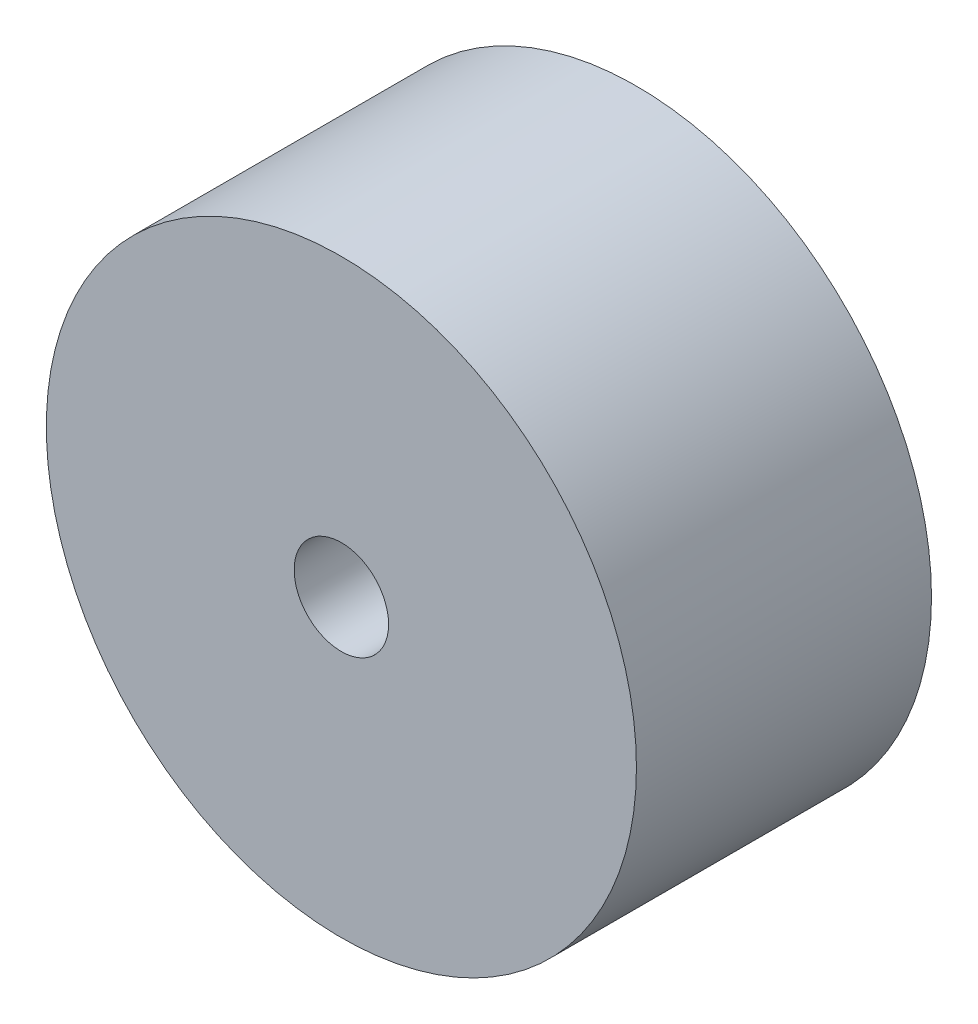
ISO-10303-21;
HEADER;
FILE_DESCRIPTION(('STEP AP214'),'2;1');
FILE_NAME('part.step','',(''),(''),'','','');
FILE_SCHEMA(('AUTOMOTIVE_DESIGN { 1 0 10303 214 1 1 1 1 }'));
ENDSEC;
DATA;
#1=APPLICATION_CONTEXT('core data for automotive mechanical design processes');
#2=APPLICATION_PROTOCOL_DEFINITION('international standard','automotive_design',2000,#1);
#3=PRODUCT_CONTEXT('',#1,'mechanical');
#4=PRODUCT('Part','Part','',(#3));
#5=PRODUCT_RELATED_PRODUCT_CATEGORY('part','',(#4));
#6=PRODUCT_DEFINITION_FORMATION('','',#4);
#7=PRODUCT_DEFINITION_CONTEXT('part definition',#1,'design');
#8=PRODUCT_DEFINITION('design','',#6,#7);
#9=PRODUCT_DEFINITION_SHAPE('','',#8);
#10=(LENGTH_UNIT() NAMED_UNIT(*) SI_UNIT(.MILLI.,.METRE.));
#11=(NAMED_UNIT(*) PLANE_ANGLE_UNIT() SI_UNIT($,.RADIAN.));
#12=(NAMED_UNIT(*) SI_UNIT($,.STERADIAN.) SOLID_ANGLE_UNIT());
#13=UNCERTAINTY_MEASURE_WITH_UNIT(LENGTH_MEASURE(1.E-05),#10,'distance_accuracy_value','');
#14=(GEOMETRIC_REPRESENTATION_CONTEXT(3) GLOBAL_UNCERTAINTY_ASSIGNED_CONTEXT((#13)) GLOBAL_UNIT_ASSIGNED_CONTEXT((#10,
#11,#12)) REPRESENTATION_CONTEXT('',''));
#15=CARTESIAN_POINT('',(0.,0.,0.));
#16=DIRECTION('',(0.,0.,1.));
#17=DIRECTION('',(1.,0.,0.));
#18=AXIS2_PLACEMENT_3D('',#15,#16,#17);
#19=CARTESIAN_POINT('',(-1.92880401323591,3.41322670969688,50.));
#20=DIRECTION('',(0.,0.,1.));
#21=DIRECTION('',(1.,0.,0.));
#22=AXIS2_PLACEMENT_3D('',#19,#20,#21);
#23=PLANE('',#22);
#24=CARTESIAN_POINT('',(-1.92880401323591,3.41322670969688,50.));
#25=DIRECTION('',(0.,0.,1.));
#26=DIRECTION('',(1.,0.,0.));
#27=AXIS2_PLACEMENT_3D('',#24,#25,#26);
#28=CIRCLE('',#27,50.);
#29=CARTESIAN_POINT('',(48.0711959867641,3.41322670969688,50.));
#30=VERTEX_POINT('',#29);
#31=EDGE_CURVE('E10',#30,#30,#28,.T.);
#32=ORIENTED_EDGE('',*,*,#31,.T.);
#33=EDGE_LOOP('',(#32));
#34=FACE_BOUND('',#33,.T.);
#35=CARTESIAN_POINT('',(-1.92880401323591,3.41322670969688,50.));
#36=DIRECTION('',(0.,0.,1.));
#37=DIRECTION('',(1.,0.,0.));
#38=AXIS2_PLACEMENT_3D('',#35,#36,#37);
#39=CIRCLE('',#38,8.);
#40=CARTESIAN_POINT('',(6.07119598676409,3.41322670969688,50.));
#41=VERTEX_POINT('',#40);
#42=EDGE_CURVE('E44',#41,#41,#39,.T.);
#43=ORIENTED_EDGE('',*,*,#42,.F.);
#44=EDGE_LOOP('',(#43));
#45=FACE_BOUND('',#44,.T.);
#46=ADVANCED_FACE('F33',(#34,#45),#23,.T.);
#47=CARTESIAN_POINT('',(-1.92880401323591,3.41322670969688,0.));
#48=DIRECTION('',(0.,0.,1.));
#49=DIRECTION('',(1.,0.,0.));
#50=AXIS2_PLACEMENT_3D('',#47,#48,#49);
#51=PLANE('',#50);
#52=CARTESIAN_POINT('',(-1.92880401323591,3.41322670969688,0.));
#53=DIRECTION('',(0.,0.,1.));
#54=DIRECTION('',(1.,0.,0.));
#55=AXIS2_PLACEMENT_3D('',#52,#53,#54);
#56=CIRCLE('',#55,50.);
#57=CARTESIAN_POINT('',(48.0711959867641,3.41322670969688,0.));
#58=VERTEX_POINT('',#57);
#59=EDGE_CURVE('E37',#58,#58,#56,.T.);
#60=ORIENTED_EDGE('',*,*,#59,.F.);
#61=EDGE_LOOP('',(#60));
#62=FACE_BOUND('',#61,.T.);
#63=CARTESIAN_POINT('',(-1.92880401323591,3.41322670969688,0.));
#64=DIRECTION('',(0.,0.,1.));
#65=DIRECTION('',(1.,0.,0.));
#66=AXIS2_PLACEMENT_3D('',#63,#64,#65);
#67=CIRCLE('',#66,8.);
#68=CARTESIAN_POINT('',(6.07119598676409,3.41322670969688,0.));
#69=VERTEX_POINT('',#68);
#70=EDGE_CURVE('E46',#69,#69,#67,.T.);
#71=ORIENTED_EDGE('',*,*,#70,.T.);
#72=EDGE_LOOP('',(#71));
#73=FACE_BOUND('',#72,.T.);
#74=ADVANCED_FACE('F56',(#62,#73),#51,.F.);
#75=CARTESIAN_POINT('',(-1.92880401323591,3.41322670969688,50.));
#76=DIRECTION('',(0.,0.,-1.));
#77=DIRECTION('',(-1.,0.,0.));
#78=AXIS2_PLACEMENT_3D('',#75,#76,#77);
#79=CYLINDRICAL_SURFACE('',#78,50.);
#80=ORIENTED_EDGE('',*,*,#31,.F.);
#81=EDGE_LOOP('',(#80));
#82=FACE_BOUND('',#81,.T.);
#83=ORIENTED_EDGE('',*,*,#59,.T.);
#84=EDGE_LOOP('',(#83));
#85=FACE_BOUND('',#84,.T.);
#86=ADVANCED_FACE('F35',(#82,#85),#79,.T.);
#87=CARTESIAN_POINT('',(-1.92880401323591,3.41322670969688,50.));
#88=DIRECTION('',(0.,0.,-1.));
#89=DIRECTION('',(-1.,0.,0.));
#90=AXIS2_PLACEMENT_3D('',#87,#88,#89);
#91=CYLINDRICAL_SURFACE('',#90,8.);
#92=ORIENTED_EDGE('',*,*,#42,.T.);
#93=EDGE_LOOP('',(#92));
#94=FACE_BOUND('',#93,.T.);
#95=ORIENTED_EDGE('',*,*,#70,.F.);
#96=EDGE_LOOP('',(#95));
#97=FACE_BOUND('',#96,.T.);
#98=ADVANCED_FACE('F52',(#94,#97),#91,.F.);
#99=CLOSED_SHELL('',(#46,#74,#86,#98));
#100=MANIFOLD_SOLID_BREP('B2',#99);
#101=ADVANCED_BREP_SHAPE_REPRESENTATION('',(#18,#100),#14);
#102=SHAPE_DEFINITION_REPRESENTATION(#9,#101);
ENDSEC;
END-ISO-10303-21;
